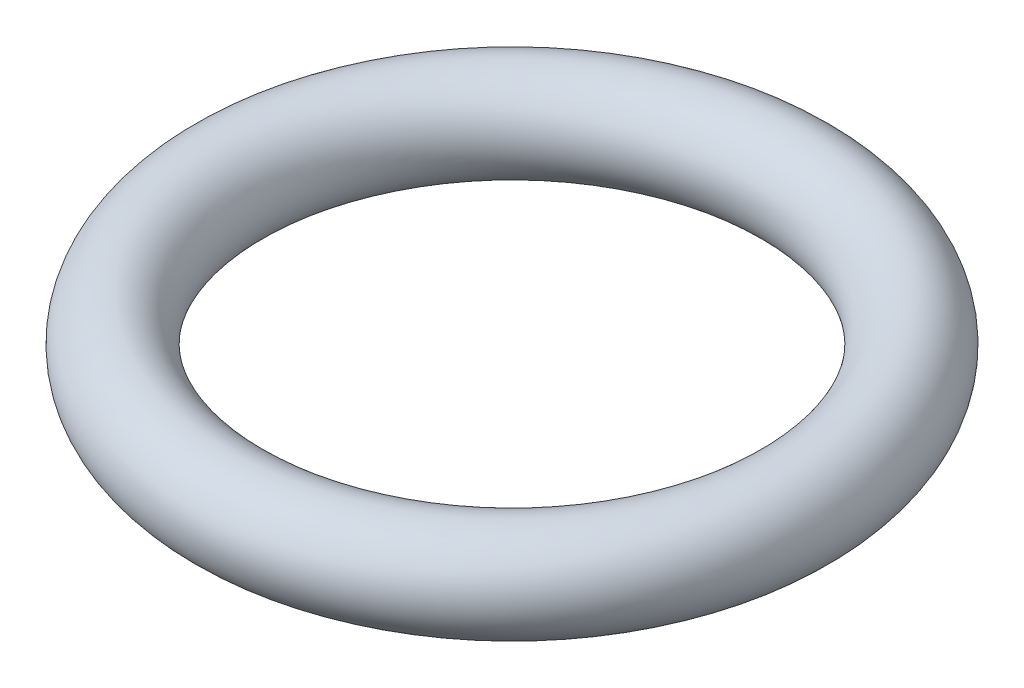
ISO-10303-21;
HEADER;
FILE_DESCRIPTION(('STEP AP214'),'2;1');
FILE_NAME('part.step','',(''),(''),'','','');
FILE_SCHEMA(('AUTOMOTIVE_DESIGN { 1 0 10303 214 1 1 1 1 }'));
ENDSEC;
DATA;
#1=APPLICATION_CONTEXT('core data for automotive mechanical design processes');
#2=APPLICATION_PROTOCOL_DEFINITION('international standard','automotive_design',2000,#1);
#3=PRODUCT_CONTEXT('',#1,'mechanical');
#4=PRODUCT('Part','Part','',(#3));
#5=PRODUCT_RELATED_PRODUCT_CATEGORY('part','',(#4));
#6=PRODUCT_DEFINITION_FORMATION('','',#4);
#7=PRODUCT_DEFINITION_CONTEXT('part definition',#1,'design');
#8=PRODUCT_DEFINITION('design','',#6,#7);
#9=PRODUCT_DEFINITION_SHAPE('','',#8);
#10=(LENGTH_UNIT() NAMED_UNIT(*) SI_UNIT(.MILLI.,.METRE.));
#11=(NAMED_UNIT(*) PLANE_ANGLE_UNIT() SI_UNIT($,.RADIAN.));
#12=(NAMED_UNIT(*) SI_UNIT($,.STERADIAN.) SOLID_ANGLE_UNIT());
#13=UNCERTAINTY_MEASURE_WITH_UNIT(LENGTH_MEASURE(1.E-05),#10,'distance_accuracy_value','');
#14=(GEOMETRIC_REPRESENTATION_CONTEXT(3) GLOBAL_UNCERTAINTY_ASSIGNED_CONTEXT((#13)) GLOBAL_UNIT_ASSIGNED_CONTEXT((#10,
#11,#12)) REPRESENTATION_CONTEXT('',''));
#15=CARTESIAN_POINT('',(0.,0.,0.));
#16=DIRECTION('',(0.,0.,1.));
#17=DIRECTION('',(1.,0.,0.));
#18=AXIS2_PLACEMENT_3D('',#15,#16,#17);
#19=CARTESIAN_POINT('',(0.,0.,0.));
#20=DIRECTION('',(0.,-1.,0.));
#21=DIRECTION('',(0.,0.,-1.));
#22=AXIS2_PLACEMENT_3D('',#19,#20,#21);
#23=TOROIDAL_SURFACE('',#22,152.4,25.4);
#24=CARTESIAN_POINT('',(0.,0.,-177.8));
#25=VERTEX_POINT('',#24);
#26=VERTEX_LOOP('',#25);
#27=FACE_BOUND('',#26,.T.);
#28=ADVANCED_FACE('F28',(#27),#23,.T.);
#29=CLOSED_SHELL('',(#28));
#30=MANIFOLD_SOLID_BREP('B2',#29);
#31=ADVANCED_BREP_SHAPE_REPRESENTATION('',(#18,#30),#14);
#32=SHAPE_DEFINITION_REPRESENTATION(#9,#31);
ENDSEC;
END-ISO-10303-21;
